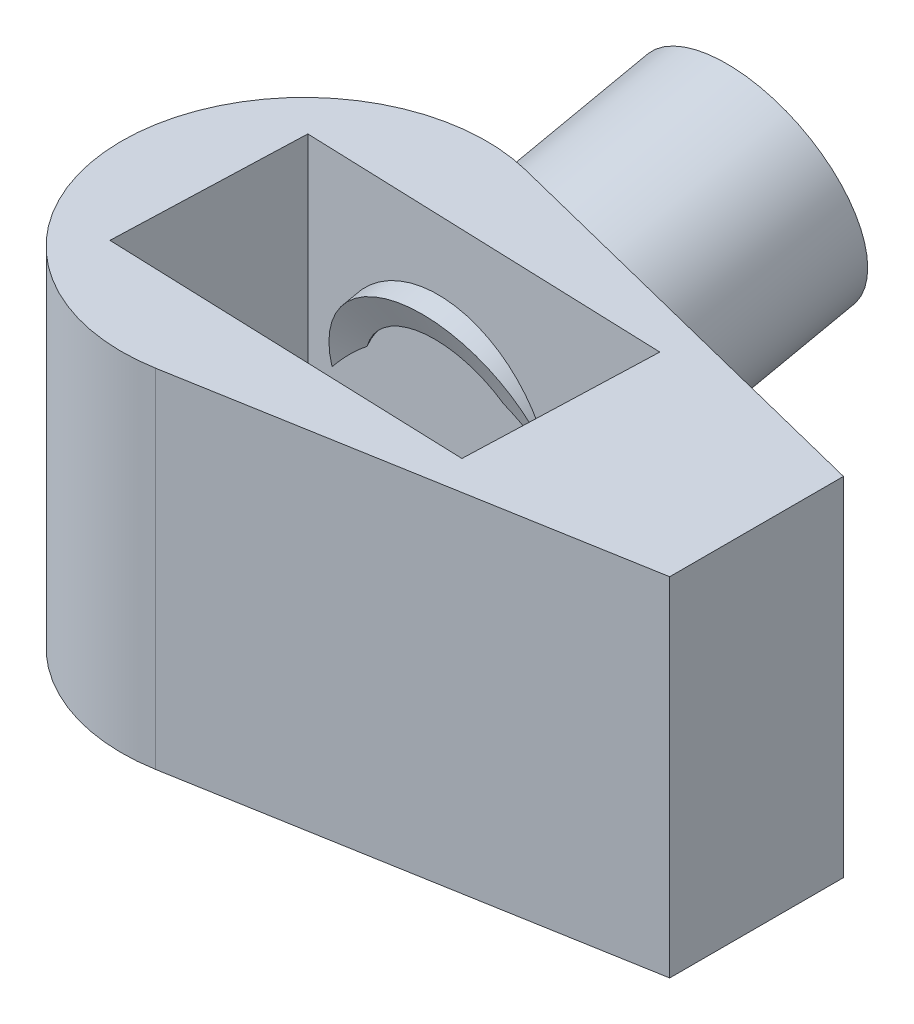
ISO-10303-21;
HEADER;
FILE_DESCRIPTION(('STEP AP214'),'2;1');
FILE_NAME('part.step','',(''),(''),'','','');
FILE_SCHEMA(('AUTOMOTIVE_DESIGN { 1 0 10303 214 1 1 1 1 }'));
ENDSEC;
DATA;
#1=APPLICATION_CONTEXT('core data for automotive mechanical design processes');
#2=APPLICATION_PROTOCOL_DEFINITION('international standard','automotive_design',2000,#1);
#3=PRODUCT_CONTEXT('',#1,'mechanical');
#4=PRODUCT('Part','Part','',(#3));
#5=PRODUCT_RELATED_PRODUCT_CATEGORY('part','',(#4));
#6=PRODUCT_DEFINITION_FORMATION('','',#4);
#7=PRODUCT_DEFINITION_CONTEXT('part definition',#1,'design');
#8=PRODUCT_DEFINITION('design','',#6,#7);
#9=PRODUCT_DEFINITION_SHAPE('','',#8);
#10=(LENGTH_UNIT() NAMED_UNIT(*) SI_UNIT(.MILLI.,.METRE.));
#11=(NAMED_UNIT(*) PLANE_ANGLE_UNIT() SI_UNIT($,.RADIAN.));
#12=(NAMED_UNIT(*) SI_UNIT($,.STERADIAN.) SOLID_ANGLE_UNIT());
#13=UNCERTAINTY_MEASURE_WITH_UNIT(LENGTH_MEASURE(1.E-05),#10,'distance_accuracy_value','');
#14=(GEOMETRIC_REPRESENTATION_CONTEXT(3) GLOBAL_UNCERTAINTY_ASSIGNED_CONTEXT((#13)) GLOBAL_UNIT_ASSIGNED_CONTEXT((#10,
#11,#12)) REPRESENTATION_CONTEXT('',''));
#15=CARTESIAN_POINT('',(0.,0.,0.));
#16=DIRECTION('',(0.,0.,1.));
#17=DIRECTION('',(1.,0.,0.));
#18=AXIS2_PLACEMENT_3D('',#15,#16,#17);
#19=CARTESIAN_POINT('',(0.390162289046507,15.,-11.0216444965026));
#20=DIRECTION('',(-0.0353774843420394,0.,0.999374020875882));
#21=DIRECTION('',(0.999374020875883,0.,0.0353774843420394));
#22=AXIS2_PLACEMENT_3D('',#19,#20,#21);
#23=PLANE('',#22);
#24=DIRECTION('',(0.999374020875883,0.,0.0353774843420394));
#25=VECTOR('',#24,1.);
#26=CARTESIAN_POINT('',(0.390162289046507,40.,-11.0216444965026));
#27=LINE('',#26,#25);
#28=CARTESIAN_POINT('',(-10.9888395087413,40.,-11.4244571067168));
#29=VERTEX_POINT('',#28);
#30=CARTESIAN_POINT('',(31.0111604912587,40.,-9.93767206795486));
#31=VERTEX_POINT('',#30);
#32=EDGE_CURVE('E273',#29,#31,#27,.T.);
#33=ORIENTED_EDGE('',*,*,#32,.F.);
#34=DIRECTION('',(0.,1.,0.));
#35=VECTOR('',#34,1.);
#36=CARTESIAN_POINT('',(-10.9888395087413,15.,-11.4244571067168));
#37=LINE('',#36,#35);
#38=CARTESIAN_POINT('',(-10.9888395087413,15.,-11.4244571067168));
#39=VERTEX_POINT('',#38);
#40=EDGE_CURVE('E312',#39,#29,#37,.T.);
#41=ORIENTED_EDGE('',*,*,#40,.F.);
#42=DIRECTION('',(0.999374020875883,0.,0.0353774843420394));
#43=VECTOR('',#42,1.);
#44=CARTESIAN_POINT('',(0.390162289046507,15.,-11.0216444965026));
#45=LINE('',#44,#43);
#46=CARTESIAN_POINT('',(31.0111604912587,15.,-9.93767206795486));
#47=VERTEX_POINT('',#46);
#48=EDGE_CURVE('E290',#39,#47,#45,.T.);
#49=ORIENTED_EDGE('',*,*,#48,.T.);
#50=DIRECTION('',(0.,1.,0.));
#51=VECTOR('',#50,1.);
#52=CARTESIAN_POINT('',(31.0111604912587,15.,-9.93767206795486));
#53=LINE('',#52,#51);
#54=EDGE_CURVE('E298',#47,#31,#53,.T.);
#55=ORIENTED_EDGE('',*,*,#54,.T.);
#56=EDGE_LOOP('',(#33,#41,#49,#55));
#57=FACE_BOUND('',#56,.T.);
#58=CARTESIAN_POINT('',(-8.10463004129563,18.2823321103349,-11.3223571189822));
#59=CARTESIAN_POINT('',(-7.86507218803505,18.5747643194951,-11.3138768563121));
#60=CARTESIAN_POINT('',(-7.62092300390691,18.8634162145207,-11.3052340621647));
#61=CARTESIAN_POINT('',(-7.12270332793711,19.4321999292052,-11.2875972631112));
#62=CARTESIAN_POINT('',(-6.86862911426903,19.7123284812365,-11.2786031264537));
#63=CARTESIAN_POINT('',(-6.08797754124081,20.5410367033428,-11.2509683388521));
#64=CARTESIAN_POINT('',(-5.54546133926437,21.0748591606041,-11.2317634585573));
#65=CARTESIAN_POINT('',(-4.40533458470522,22.098919349614,-11.1914033775818));
#66=CARTESIAN_POINT('',(-3.80700800324318,22.5883651434617,-11.1702228297339));
#67=CARTESIAN_POINT('',(-2.56073842819134,23.497381559857,-11.1261053307231));
#68=CARTESIAN_POINT('',(-1.91291852857135,23.9171177944699,-11.103172737043));
#69=CARTESIAN_POINT('',(-0.859637213780255,24.5062664109901,-11.0658869536992));
#70=CARTESIAN_POINT('',(-0.470643175732469,24.7053910257217,-11.0521167033197));
#71=CARTESIAN_POINT('',(0.322025251611424,25.0722064811563,-11.0240565233561));
#72=CARTESIAN_POINT('',(0.72570062138474,25.2398952178277,-11.0097665590633));
#73=CARTESIAN_POINT('',(1.54311872938382,25.5397335489275,-10.9808302492208));
#74=CARTESIAN_POINT('',(1.95678003143542,25.6721047555759,-10.9661867864826));
#75=CARTESIAN_POINT('',(2.79404508436814,25.9003924441802,-10.9365479018593));
#76=CARTESIAN_POINT('',(3.21764840909109,25.9963104856577,-10.92155249506));
#77=CARTESIAN_POINT('',(4.07346648592365,26.1506931040782,-10.8912568399996));
#78=CARTESIAN_POINT('',(4.50571000202654,26.2089981662866,-10.8759555735033));
#79=CARTESIAN_POINT('',(5.37362324879664,26.2873762894889,-10.8452317537357));
#80=CARTESIAN_POINT('',(5.80929300527063,26.3074490622358,-10.8298091995508));
#81=CARTESIAN_POINT('',(6.68178542557414,26.3104219272778,-10.7989232786712));
#82=CARTESIAN_POINT('',(7.11860830476361,26.2932310484653,-10.783459904353));
#83=CARTESIAN_POINT('',(7.98940117316629,26.2235597669514,-10.7526341470053));
#84=CARTESIAN_POINT('',(8.42337082274452,26.1710752371969,-10.7372717759989));
#85=CARTESIAN_POINT('',(9.42810760415459,26.0108756786185,-10.7017044518443));
#86=CARTESIAN_POINT('',(9.99689469437586,25.8906689712896,-10.6815695914637));
#87=CARTESIAN_POINT('',(11.1214685021807,25.5999200636733,-10.6417600792631));
#88=CARTESIAN_POINT('',(11.677249422524,25.4293558619823,-10.6220856326632));
#89=CARTESIAN_POINT('',(12.7748099584142,25.0447603734219,-10.5832323806656));
#90=CARTESIAN_POINT('',(13.3165557831709,24.8306335111947,-10.5640547714499));
#91=CARTESIAN_POINT('',(14.3838694000311,24.3658356829621,-10.5262722496115));
#92=CARTESIAN_POINT('',(14.9094409542287,24.115173294035,-10.5076672038119));
#93=CARTESIAN_POINT('',(15.9223723640675,23.5944711219716,-10.47180979273));
#94=CARTESIAN_POINT('',(16.4104036562152,23.3257273654761,-10.4545336588345));
#95=CARTESIAN_POINT('',(17.369325834972,22.7658825980183,-10.4205881552937));
#96=CARTESIAN_POINT('',(17.8403066467389,22.474936194069,-10.4039156023299));
#97=CARTESIAN_POINT('',(18.3046300412956,22.1740563894652,-10.3874787195639));
#98=B_SPLINE_CURVE_WITH_KNOTS('',3,(#58,#59,#60,#61,#62,#63,#64,#65,#66,#67,#68,#69,#70,#71,#72,
#73,#74,#75,#76,#77,#78,#79,#80,#81,#82,#83,#84,#85,#86,#87,#88,#89,#90,#91,#92,#93,#94,#95,#96,
#97),.UNSPECIFIED.,.F.,.F.,(4,2,2,2,2,2,2,2,2,2,2,2,2,2,2,2,2,2,2,4),(0.,1.13427500789395,
2.26897952397378,4.55024551512717,6.86641979101333,9.17701017769297,10.4874812567885,
11.7980400155992,13.1001707584187,14.4022457878421,15.7098071673346,17.0173784049656,
18.328145388068,19.6390656719955,21.3813941843134,23.1244850567162,24.8714422866016,
26.6179900594822,28.2894651268306,29.9502095321943),.UNSPECIFIED.);
#99=CARTESIAN_POINT('',(12.3552544705409,25.1913241914903,-10.5980844954823));
#100=VERTEX_POINT('',#99);
#101=CARTESIAN_POINT('',(17.6710159300358,22.5757516833046,-10.4099084333965));
#102=VERTEX_POINT('',#101);
#103=EDGE_CURVE('E130',#100,#102,#98,.T.);
#104=ORIENTED_EDGE('',*,*,#103,.F.);
#105=CARTESIAN_POINT('',(5.1,18.5393786705713,-10.854917919273));
#106=DIRECTION('',(-0.0353774843420394,0.,0.999374020875882));
#107=DIRECTION('',(0.163919590360563,-0.9864566369717,0.00580269510733514));
#108=AXIS2_PLACEMENT_3D('',#105,#106,#107);
#109=ELLIPSE('',#108,10.0062637121946,9.78105928984873);
#110=CARTESIAN_POINT('',(-3.9161072784306,22.4841222657709,-11.1740849052122));
#111=VERTEX_POINT('',#110);
#112=EDGE_CURVE('E11',#100,#111,#109,.T.);
#113=ORIENTED_EDGE('',*,*,#112,.T.);
#114=CARTESIAN_POINT('',(-8.09997176306033,18.2880178975854,-11.3221922175921));
#115=VERTEX_POINT('',#114);
#116=EDGE_CURVE('E43',#115,#111,#98,.T.);
#117=ORIENTED_EDGE('',*,*,#116,.F.);
#118=CARTESIAN_POINT('',(5.1,18.5393786705713,-10.854917919273));
#119=DIRECTION('',(-0.0353774843420394,0.,0.999374020875882));
#120=DIRECTION('',(0.163919590360563,-0.9864566369717,0.00580269510733514));
#121=AXIS2_PLACEMENT_3D('',#118,#119,#120);
#122=ELLIPSE('',#121,13.5084560114626,13.2044300412956);
#123=EDGE_CURVE('E123',#102,#115,#122,.T.);
#124=ORIENTED_EDGE('',*,*,#123,.F.);
#125=EDGE_LOOP('',(#104,#113,#117,#124));
#126=FACE_BOUND('',#125,.T.);
#127=ADVANCED_FACE('F34',(#57,#126),#23,.T.);
#128=CARTESIAN_POINT('',(0.,40.,0.));
#129=DIRECTION('',(0.,-1.,0.));
#130=DIRECTION('',(0.,0.,-1.));
#131=AXIS2_PLACEMENT_3D('',#128,#129,#130);
#132=CYLINDRICAL_SURFACE('',#131,6.);
#133=CARTESIAN_POINT('',(0.,6.,0.));
#134=DIRECTION('',(0.,-1.,0.));
#135=DIRECTION('',(0.,0.,-1.));
#136=AXIS2_PLACEMENT_3D('',#133,#134,#135);
#137=CIRCLE('',#136,6.);
#138=CARTESIAN_POINT('',(0.,6.,-6.));
#139=VERTEX_POINT('',#138);
#140=EDGE_CURVE('E309',#139,#139,#137,.T.);
#141=ORIENTED_EDGE('',*,*,#140,.T.);
#142=EDGE_LOOP('',(#141));
#143=FACE_BOUND('',#142,.T.);
#144=CARTESIAN_POINT('',(0.,9.5,0.));
#145=DIRECTION('',(0.,1.,0.));
#146=DIRECTION('',(0.,0.,1.));
#147=AXIS2_PLACEMENT_3D('',#144,#145,#146);
#148=CIRCLE('',#147,6.);
#149=CARTESIAN_POINT('',(0.,9.5,6.));
#150=VERTEX_POINT('',#149);
#151=EDGE_CURVE('E266',#150,#150,#148,.F.);
#152=ORIENTED_EDGE('',*,*,#151,.F.);
#153=EDGE_LOOP('',(#152));
#154=FACE_BOUND('',#153,.T.);
#155=ADVANCED_FACE('F179',(#143,#154),#132,.F.);
#156=CARTESIAN_POINT('',(0.,40.,0.));
#157=DIRECTION('',(0.,1.,0.));
#158=DIRECTION('',(0.,0.,1.));
#159=AXIS2_PLACEMENT_3D('',#156,#157,#158);
#160=PLANE('',#159);
#161=CARTESIAN_POINT('',(0.,40.,0.));
#162=DIRECTION('',(0.,1.,0.));
#163=DIRECTION('',(0.,0.,1.));
#164=AXIS2_PLACEMENT_3D('',#161,#162,#163);
#165=CIRCLE('',#164,21.);
#166=CARTESIAN_POINT('',(5.10954501363541,40.,-20.3689113541601));
#167=VERTEX_POINT('',#166);
#168=CARTESIAN_POINT('',(3.61379341166937,40.,20.6867227268549));
#169=VERTEX_POINT('',#168);
#170=EDGE_CURVE('E135',#167,#169,#165,.T.);
#171=ORIENTED_EDGE('',*,*,#170,.T.);
#172=DIRECTION('',(0.985082034612138,0.,-0.172085400555684));
#173=VECTOR('',#172,1.);
#174=CARTESIAN_POINT('',(53.9751275761126,40.,11.889028669203));
#175=LINE('',#174,#173);
#176=CARTESIAN_POINT('',(53.9751275761126,40.,11.889028669203));
#177=VERTEX_POINT('',#176);
#178=EDGE_CURVE('E320',#169,#177,#175,.T.);
#179=ORIENTED_EDGE('',*,*,#178,.T.);
#180=DIRECTION('',(0.,0.,-1.));
#181=VECTOR('',#180,1.);
#182=CARTESIAN_POINT('',(53.9751275761126,40.,-8.11097133079702));
#183=LINE('',#182,#181);
#184=CARTESIAN_POINT('',(53.9751275761126,40.,-8.11097133079702));
#185=VERTEX_POINT('',#184);
#186=EDGE_CURVE('E252',#177,#185,#183,.T.);
#187=ORIENTED_EDGE('',*,*,#186,.T.);
#188=DIRECTION('',(-0.969948159721911,0.,-0.243311667315972));
#189=VECTOR('',#188,1.);
#190=CARTESIAN_POINT('',(53.9751275761126,40.,-8.11097133079702));
#191=LINE('',#190,#189);
#192=EDGE_CURVE('E256',#185,#167,#191,.T.);
#193=ORIENTED_EDGE('',*,*,#192,.T.);
#194=EDGE_LOOP('',(#171,#179,#187,#193));
#195=FACE_BOUND('',#194,.T.);
#196=ORIENTED_EDGE('',*,*,#32,.T.);
#197=DIRECTION('',(-0.0353774843420385,0.,0.999374020875883));
#198=VECTOR('',#197,1.);
#199=CARTESIAN_POINT('',(30.6209982022122,40.,1.08397242854774));
#200=LINE('',#199,#198);
#201=CARTESIAN_POINT('',(30.2323683280976,40.,12.0623279320451));
#202=VERTEX_POINT('',#201);
#203=EDGE_CURVE('E268',#31,#202,#200,.T.);
#204=ORIENTED_EDGE('',*,*,#203,.T.);
#205=DIRECTION('',(0.999374020875883,0.,0.0353774843420387));
#206=VECTOR('',#205,1.);
#207=CARTESIAN_POINT('',(-0.388629874114518,40.,10.9783555034974));
#208=LINE('',#207,#206);
#209=CARTESIAN_POINT('',(-11.7676316719024,40.,10.5755428932832));
#210=VERTEX_POINT('',#209);
#211=EDGE_CURVE('E291',#210,#202,#208,.T.);
#212=ORIENTED_EDGE('',*,*,#211,.F.);
#213=DIRECTION('',(-0.035377484342039,0.,0.999374020875883));
#214=VECTOR('',#213,1.);
#215=CARTESIAN_POINT('',(-11.3790017977878,40.,-0.402812610214199));
#216=LINE('',#215,#214);
#217=EDGE_CURVE('E302',#29,#210,#216,.T.);
#218=ORIENTED_EDGE('',*,*,#217,.F.);
#219=EDGE_LOOP('',(#196,#204,#212,#218));
#220=FACE_BOUND('',#219,.T.);
#221=ADVANCED_FACE('F191',(#195,#220),#160,.T.);
#222=CARTESIAN_POINT('',(0.,40.,0.));
#223=DIRECTION('',(0.,-1.,0.));
#224=DIRECTION('',(0.,0.,-1.));
#225=AXIS2_PLACEMENT_3D('',#222,#223,#224);
#226=CYLINDRICAL_SURFACE('',#225,21.);
#227=DIRECTION('',(0.,-1.,0.));
#228=VECTOR('',#227,1.);
#229=CARTESIAN_POINT('',(5.10954501363541,40.,-20.3689113541601));
#230=LINE('',#229,#228);
#231=CARTESIAN_POINT('',(5.10954501363541,34.0636290657894,-20.3689113541601));
#232=VERTEX_POINT('',#231);
#233=EDGE_CURVE('E237',#167,#232,#230,.T.);
#234=ORIENTED_EDGE('',*,*,#233,.T.);
#235=CARTESIAN_POINT('',(5.10954501363542,34.0636290657894,-20.3689113541601));
#236=CARTESIAN_POINT('',(4.96690858849741,34.071348619486,-20.4046932743508));
#237=CARTESIAN_POINT('',(4.82377420576992,34.076390010948,-20.4390039409712));
#238=CARTESIAN_POINT('',(4.53672862365238,34.0810190605895,-20.5046278810853));
#239=CARTESIAN_POINT('',(4.39281740268119,34.0806065664686,-20.5359410708494));
#240=CARTESIAN_POINT('',(3.96032095910489,34.0710430746702,-20.6252864457771));
#241=CARTESIAN_POINT('',(3.67091161737172,34.0535694600003,-20.6787398236085));
#242=CARTESIAN_POINT('',(3.09365112153879,33.9961488780052,-20.7729271192266));
#243=CARTESIAN_POINT('',(2.8057988668544,33.9563044771656,-20.8137177774438));
#244=CARTESIAN_POINT('',(2.232605276756,33.8542486196363,-20.8829785388524));
#245=CARTESIAN_POINT('',(1.94726373138935,33.7920390517508,-20.9114496820158));
#246=CARTESIAN_POINT('',(1.38109937488225,33.6456343705411,-20.9564616476082));
#247=CARTESIAN_POINT('',(1.10028018529665,33.561422484691,-20.972993332155));
#248=CARTESIAN_POINT('',(0.545422540072888,33.3718304653229,-20.9947521701638));
#249=CARTESIAN_POINT('',(0.271384690003213,33.266448448935,-20.9999783176253));
#250=CARTESIAN_POINT('',(-0.268194514379263,33.0355528892135,-21.000021561548));
#251=CARTESIAN_POINT('',(-0.533732042190592,32.910030428177,-20.994834035319));
#252=CARTESIAN_POINT('',(-1.05467272261733,32.6401556915788,-20.9751191491249));
#253=CARTESIAN_POINT('',(-1.31007576924992,32.4958032191672,-20.9605916915135));
#254=CARTESIAN_POINT('',(-1.81498400809248,32.1862867400207,-20.9229854193896));
#255=CARTESIAN_POINT('',(-2.06423924069272,32.0207376365431,-20.8997270853096));
#256=CARTESIAN_POINT('',(-2.54998013297256,31.6728077159789,-20.8460389225978));
#257=CARTESIAN_POINT('',(-2.78646185507135,31.4904217551472,-20.8156068979265));
#258=CARTESIAN_POINT('',(-3.24589404486634,31.1102193410556,-20.7489294558432));
#259=CARTESIAN_POINT('',(-3.46884076599773,30.9123986496908,-20.7126824388309));
#260=CARTESIAN_POINT('',(-3.9005792875719,30.5026952048927,-20.6357352827187));
#261=CARTESIAN_POINT('',(-4.10937037826527,30.2908117474188,-20.5950349205996));
#262=CARTESIAN_POINT('',(-4.54807572032634,29.815518686567,-20.5030180512679));
#263=CARTESIAN_POINT('',(-4.77518160312074,29.549629701146,-20.4510980158676));
#264=CARTESIAN_POINT('',(-5.20864006606995,29.0018513412773,-20.3450207319004));
#265=CARTESIAN_POINT('',(-5.41499010791089,28.7199600164187,-20.2908632108422));
#266=CARTESIAN_POINT('',(-5.80656924791153,28.1416064504079,-20.1822958669106));
#267=CARTESIAN_POINT('',(-5.99178237295665,27.8451334288486,-20.127885885144));
#268=CARTESIAN_POINT('',(-6.34039384285721,27.2393210942914,-20.0208056225972));
#269=CARTESIAN_POINT('',(-6.50379093681024,26.9299810448479,-19.9681354417049));
#270=CARTESIAN_POINT('',(-6.83141087320832,26.2517951250423,-19.858652011427));
#271=CARTESIAN_POINT('',(-6.99195841855568,25.8810695740226,-19.8024321517711));
#272=CARTESIAN_POINT('',(-7.28224671649502,25.1266637508893,-19.6975307313211));
#273=CARTESIAN_POINT('',(-7.41198431886526,24.7429821586377,-19.6488499415505));
#274=CARTESIAN_POINT('',(-7.63939205987374,23.9651725107016,-19.5615577214256));
#275=CARTESIAN_POINT('',(-7.73706934758696,23.5710468051454,-19.5229440466181));
#276=CARTESIAN_POINT('',(-7.89905704770002,22.7749951747849,-19.4579686075227));
#277=CARTESIAN_POINT('',(-7.96336993127771,22.3730698299592,-19.4316059358634));
#278=CARTESIAN_POINT('',(-8.05631848899731,21.5731075465164,-19.3932518688941));
#279=CARTESIAN_POINT('',(-8.08568516819968,21.1751702382879,-19.3809662218588));
#280=CARTESIAN_POINT('',(-8.11013083862967,20.3780291763897,-19.3707504355202));
#281=CARTESIAN_POINT('',(-8.10521011547181,19.9788254332971,-19.3728201766365));
#282=CARTESIAN_POINT('',(-8.06034754464219,19.1830056966958,-19.3915287220619));
#283=CARTESIAN_POINT('',(-8.02043081967606,18.7863880524199,-19.4081570751162));
#284=CARTESIAN_POINT('',(-7.90531446838263,17.9991608678849,-19.4553301217445));
#285=CARTESIAN_POINT('',(-7.83011807563186,17.6085507803878,-19.4858735399183));
#286=CARTESIAN_POINT('',(-7.65459269815676,16.8781762575065,-19.55543613092));
#287=CARTESIAN_POINT('',(-7.55780359923154,16.5374353308134,-19.5932024296849));
#288=CARTESIAN_POINT('',(-7.33678456353165,15.8660492015516,-19.6770311253634));
#289=CARTESIAN_POINT('',(-7.21255676740382,15.5354032137092,-19.7230928750506));
#290=CARTESIAN_POINT('',(-6.9374049003406,14.8862837969699,-19.8215475303034));
#291=CARTESIAN_POINT('',(-6.78647262725708,14.5678141446266,-19.8739423794781));
#292=CARTESIAN_POINT('',(-6.45895209504381,13.9450759701463,-19.9827850819058));
#293=CARTESIAN_POINT('',(-6.28236299028932,13.6408079165175,-20.0392330687153));
#294=CARTESIAN_POINT('',(-5.90438842736474,13.0476387717968,-20.1538395924901));
#295=CARTESIAN_POINT('',(-5.70295862705616,12.7587665184868,-20.2120010430699));
#296=CARTESIAN_POINT('',(-5.27690755897406,12.1984767424352,-20.3273938529849));
#297=CARTESIAN_POINT('',(-5.05228647532779,11.9270590811405,-20.3846252197003));
#298=CARTESIAN_POINT('',(-4.58135756531356,11.4030314695946,-20.4956010841604));
#299=CARTESIAN_POINT('',(-4.33505228026011,11.1504193217886,-20.5493459892276));
#300=CARTESIAN_POINT('',(-3.8223456118923,10.6651647181945,-20.650858617518));
#301=CARTESIAN_POINT('',(-3.55594371289541,10.432522775173,-20.6986261872781));
#302=CARTESIAN_POINT('',(-2.99363811399702,9.97930617286293,-20.787553484592));
#303=CARTESIAN_POINT('',(-2.69697633890694,9.75960268083953,-20.8283669552564));
#304=CARTESIAN_POINT('',(-2.08601505129109,9.34415028397307,-20.8983989554022));
#305=CARTESIAN_POINT('',(-1.77171511411762,9.14840195622395,-20.9276172055859));
#306=CARTESIAN_POINT('',(-1.12792467548618,8.78187507210793,-20.9721690598717));
#307=CARTESIAN_POINT('',(-0.798434333282665,8.61109625404182,-20.9875028095024));
#308=CARTESIAN_POINT('',(-0.126970551280799,8.29536413186931,-21.002301021992));
#309=CARTESIAN_POINT('',(0.215002446188015,8.15040991372281,-21.0017660466234));
#310=CARTESIAN_POINT('',(0.928362049040771,7.87942922051568,-20.982672773211));
#311=CARTESIAN_POINT('',(1.300313364921,7.75495551966405,-20.9630873965633));
#312=CARTESIAN_POINT('',(2.05131117046238,7.53599809262888,-20.9029682213082));
#313=CARTESIAN_POINT('',(2.43035851060243,7.44151798594972,-20.8624318959759));
#314=CARTESIAN_POINT('',(3.19332365361217,7.28230138473823,-20.7593676854117));
#315=CARTESIAN_POINT('',(3.5772546561457,7.21768185373307,-20.6967549864686));
#316=CARTESIAN_POINT('',(4.15273326354356,7.14321306807699,-20.5862347456592));
#317=CARTESIAN_POINT('',(4.34451759548051,7.12213213057295,-20.5466208515759));
#318=CARTESIAN_POINT('',(4.72753868983291,7.08736395951102,-20.4618879576455));
#319=CARTESIAN_POINT('',(4.91877545619085,7.07367667258499,-20.4167689975373));
#320=CARTESIAN_POINT('',(5.10954501363542,7.06363611998609,-20.3689113541601));
#321=B_SPLINE_CURVE_WITH_KNOTS('',3,(#235,#236,#237,#238,#239,#240,#241,#242,#243,#244,#245,
#246,#247,#248,#249,#250,#251,#252,#253,#254,#255,#256,#257,#258,#259,#260,#261,#262,#263,#264,
#265,#266,#267,#268,#269,#270,#271,#272,#273,#274,#275,#276,#277,#278,#279,#280,#281,#282,#283,
#284,#285,#286,#287,#288,#289,#290,#291,#292,#293,#294,#295,#296,#297,#298,#299,#300,#301,#302,
#303,#304,#305,#306,#307,#308,#309,#310,#311,#312,#313,#314,#315,#316,#317,#318,#319,#320),
.UNSPECIFIED.,.F.,.F.,(4,2,2,2,2,2,2,2,2,2,2,2,2,2,2,2,2,2,2,2,2,2,2,2,2,2,2,2,2,2,2,2,2,2,2,2,
2,2,2,2,2,2,4),(0.,0.441710081270945,0.883432497377931,1.7666879719092,2.64592654695832,
3.52509088516254,4.40492738207036,5.28484216623813,6.16514763605673,7.04546230937295,
7.94496828906273,8.84474998759902,9.74477962573171,10.6448543571448,11.7043437539809,
12.7639625628336,13.8243768934597,14.8848520007548,16.1070759594581,17.3294248330425,
18.5515009516638,19.773486542706,20.9694342459812,22.165371987008,23.3604518982399,
24.5554222951859,25.6228273852867,26.6901492305182,27.7577994692779,28.8254849047583,
29.8951045861994,30.9647157760456,32.0342017775559,33.1037152315997,34.2165734298752,
35.3294584322809,36.4423317699799,37.5551657106298,38.7315233328004,39.9080228590874,
41.0890924523618,41.679798581461,42.2705004467247),.UNSPECIFIED.);
#322=CARTESIAN_POINT('',(5.10954501363541,7.06363611998609,-20.3689113541601));
#323=VERTEX_POINT('',#322);
#324=EDGE_CURVE('E56',#232,#323,#321,.T.);
#325=ORIENTED_EDGE('',*,*,#324,.T.);
#326=CARTESIAN_POINT('',(5.10954501363541,0.,-20.3689113541601));
#327=VERTEX_POINT('',#326);
#328=EDGE_CURVE('E241',#323,#327,#230,.T.);
#329=ORIENTED_EDGE('',*,*,#328,.T.);
#330=CARTESIAN_POINT('',(0.,0.,0.));
#331=DIRECTION('',(0.,1.,0.));
#332=DIRECTION('',(0.,0.,1.));
#333=AXIS2_PLACEMENT_3D('',#330,#331,#332);
#334=CIRCLE('',#333,21.);
#335=CARTESIAN_POINT('',(3.61379341166937,0.,20.6867227268549));
#336=VERTEX_POINT('',#335);
#337=EDGE_CURVE('E230',#327,#336,#334,.T.);
#338=ORIENTED_EDGE('',*,*,#337,.T.);
#339=DIRECTION('',(0.,-1.,0.));
#340=VECTOR('',#339,1.);
#341=CARTESIAN_POINT('',(3.61379341166937,40.,20.6867227268549));
#342=LINE('',#341,#340);
#343=EDGE_CURVE('E261',#169,#336,#342,.T.);
#344=ORIENTED_EDGE('',*,*,#343,.F.);
#345=ORIENTED_EDGE('',*,*,#170,.F.);
#346=EDGE_LOOP('',(#234,#325,#329,#338,#344,#345));
#347=FACE_BOUND('',#346,.T.);
#348=ADVANCED_FACE('F36',(#347),#226,.T.);
#349=CARTESIAN_POINT('',(0.,0.,0.));
#350=DIRECTION('',(0.,1.,0.));
#351=DIRECTION('',(0.,0.,1.));
#352=AXIS2_PLACEMENT_3D('',#349,#350,#351);
#353=PLANE('',#352);
#354=CARTESIAN_POINT('',(0.,0.,0.));
#355=DIRECTION('',(0.,-1.,0.));
#356=DIRECTION('',(0.,0.,-1.));
#357=AXIS2_PLACEMENT_3D('',#354,#355,#356);
#358=CIRCLE('',#357,8.22726922087799);
#359=CARTESIAN_POINT('',(0.,0.,-8.22726922087799));
#360=VERTEX_POINT('',#359);
#361=EDGE_CURVE('E226',#360,#360,#358,.T.);
#362=ORIENTED_EDGE('',*,*,#361,.F.);
#363=EDGE_LOOP('',(#362));
#364=FACE_BOUND('',#363,.T.);
#365=ORIENTED_EDGE('',*,*,#337,.F.);
#366=DIRECTION('',(-0.969948159721911,0.,-0.243311667315972));
#367=VECTOR('',#366,1.);
#368=CARTESIAN_POINT('',(53.9751275761126,0.,-8.11097133079702));
#369=LINE('',#368,#367);
#370=CARTESIAN_POINT('',(53.9751275761126,0.,-8.11097133079702));
#371=VERTEX_POINT('',#370);
#372=EDGE_CURVE('E233',#371,#327,#369,.T.);
#373=ORIENTED_EDGE('',*,*,#372,.F.);
#374=DIRECTION('',(0.,0.,-1.));
#375=VECTOR('',#374,1.);
#376=CARTESIAN_POINT('',(53.9751275761126,0.,-8.11097133079702));
#377=LINE('',#376,#375);
#378=CARTESIAN_POINT('',(53.9751275761126,0.,11.889028669203));
#379=VERTEX_POINT('',#378);
#380=EDGE_CURVE('E247',#379,#371,#377,.T.);
#381=ORIENTED_EDGE('',*,*,#380,.F.);
#382=DIRECTION('',(0.985082034612138,0.,-0.172085400555684));
#383=VECTOR('',#382,1.);
#384=CARTESIAN_POINT('',(53.9751275761126,0.,11.889028669203));
#385=LINE('',#384,#383);
#386=EDGE_CURVE('E234',#336,#379,#385,.T.);
#387=ORIENTED_EDGE('',*,*,#386,.F.);
#388=EDGE_LOOP('',(#365,#373,#381,#387));
#389=FACE_BOUND('',#388,.T.);
#390=ADVANCED_FACE('F211',(#364,#389),#353,.F.);
#391=CARTESIAN_POINT('',(53.9751275761126,40.,-8.11097133079702));
#392=DIRECTION('',(-0.243311667315972,0.,0.969948159721911));
#393=DIRECTION('',(0.969948159721911,0.,0.243311667315972));
#394=AXIS2_PLACEMENT_3D('',#391,#392,#393);
#395=PLANE('',#394);
#396=ORIENTED_EDGE('',*,*,#328,.F.);
#397=CARTESIAN_POINT('',(5.1,20.5641420329638,-20.3713057225178));
#398=DIRECTION('',(-0.243311667315972,0.,0.969948159721911));
#399=DIRECTION('',(0.730156283383229,-0.658273710171416,0.183159832750383));
#400=AXIS2_PLACEMENT_3D('',#397,#398,#399);
#401=ELLIPSE('',#400,13.9182696154307,13.2044300412956);
#402=EDGE_CURVE('E141',#323,#232,#401,.T.);
#403=ORIENTED_EDGE('',*,*,#402,.T.);
#404=ORIENTED_EDGE('',*,*,#233,.F.);
#405=ORIENTED_EDGE('',*,*,#192,.F.);
#406=DIRECTION('',(0.,-1.,0.));
#407=VECTOR('',#406,1.);
#408=CARTESIAN_POINT('',(53.9751275761126,40.,-8.11097133079702));
#409=LINE('',#408,#407);
#410=EDGE_CURVE('E244',#185,#371,#409,.T.);
#411=ORIENTED_EDGE('',*,*,#410,.T.);
#412=ORIENTED_EDGE('',*,*,#372,.T.);
#413=EDGE_LOOP('',(#396,#403,#404,#405,#411,#412));
#414=FACE_BOUND('',#413,.T.);
#415=ADVANCED_FACE('F207',(#414),#395,.F.);
#416=CARTESIAN_POINT('',(53.9751275761126,40.,11.889028669203));
#417=DIRECTION('',(-0.172085400555684,0.,-0.985082034612138));
#418=DIRECTION('',(-0.985082034612138,0.,0.172085400555684));
#419=AXIS2_PLACEMENT_3D('',#416,#417,#418);
#420=PLANE('',#419);
#421=ORIENTED_EDGE('',*,*,#386,.T.);
#422=DIRECTION('',(0.,-1.,0.));
#423=VECTOR('',#422,1.);
#424=CARTESIAN_POINT('',(53.9751275761126,40.,11.889028669203));
#425=LINE('',#424,#423);
#426=EDGE_CURVE('E258',#177,#379,#425,.T.);
#427=ORIENTED_EDGE('',*,*,#426,.F.);
#428=ORIENTED_EDGE('',*,*,#178,.F.);
#429=ORIENTED_EDGE('',*,*,#343,.T.);
#430=EDGE_LOOP('',(#421,#427,#428,#429));
#431=FACE_BOUND('',#430,.T.);
#432=ADVANCED_FACE('F203',(#431),#420,.F.);
#433=CARTESIAN_POINT('',(53.9751275761126,40.,-8.11097133079702));
#434=DIRECTION('',(-1.,0.,0.));
#435=DIRECTION('',(0.,0.,1.));
#436=AXIS2_PLACEMENT_3D('',#433,#434,#435);
#437=PLANE('',#436);
#438=ORIENTED_EDGE('',*,*,#380,.T.);
#439=ORIENTED_EDGE('',*,*,#410,.F.);
#440=ORIENTED_EDGE('',*,*,#186,.F.);
#441=ORIENTED_EDGE('',*,*,#426,.T.);
#442=EDGE_LOOP('',(#438,#439,#440,#441));
#443=FACE_BOUND('',#442,.T.);
#444=ADVANCED_FACE('F199',(#443),#437,.F.);
#445=CARTESIAN_POINT('',(0.,6.,0.));
#446=DIRECTION('',(0.,-1.,0.));
#447=DIRECTION('',(0.,0.,-1.));
#448=AXIS2_PLACEMENT_3D('',#445,#446,#447);
#449=CYLINDRICAL_SURFACE('',#448,8.22726922087799);
#450=CARTESIAN_POINT('',(0.,6.,0.));
#451=DIRECTION('',(0.,-1.,0.));
#452=DIRECTION('',(0.,0.,-1.));
#453=AXIS2_PLACEMENT_3D('',#450,#451,#452);
#454=CIRCLE('',#453,8.22726922087799);
#455=CARTESIAN_POINT('',(0.,6.,-8.22726922087799));
#456=VERTEX_POINT('',#455);
#457=EDGE_CURVE('E245',#456,#456,#454,.T.);
#458=ORIENTED_EDGE('',*,*,#457,.F.);
#459=EDGE_LOOP('',(#458));
#460=FACE_BOUND('',#459,.T.);
#461=ORIENTED_EDGE('',*,*,#361,.T.);
#462=EDGE_LOOP('',(#461));
#463=FACE_BOUND('',#462,.T.);
#464=ADVANCED_FACE('F195',(#460,#463),#449,.F.);
#465=CARTESIAN_POINT('',(0.,6.,0.));
#466=DIRECTION('',(0.,-1.,0.));
#467=DIRECTION('',(0.,0.,-1.));
#468=AXIS2_PLACEMENT_3D('',#465,#466,#467);
#469=PLANE('',#468);
#470=ORIENTED_EDGE('',*,*,#140,.F.);
#471=EDGE_LOOP('',(#470));
#472=FACE_BOUND('',#471,.T.);
#473=ORIENTED_EDGE('',*,*,#457,.T.);
#474=EDGE_LOOP('',(#473));
#475=FACE_BOUND('',#474,.T.);
#476=ADVANCED_FACE('F187',(#472,#475),#469,.T.);
#477=CARTESIAN_POINT('',(30.6209982022122,15.,1.08397242854774));
#478=DIRECTION('',(-0.999374020875883,0.,-0.0353774843420385));
#479=DIRECTION('',(-0.0353774843420385,0.,0.999374020875883));
#480=AXIS2_PLACEMENT_3D('',#477,#478,#479);
#481=PLANE('',#480);
#482=ORIENTED_EDGE('',*,*,#203,.F.);
#483=ORIENTED_EDGE('',*,*,#54,.F.);
#484=DIRECTION('',(-0.0353774843420385,0.,0.999374020875883));
#485=VECTOR('',#484,1.);
#486=CARTESIAN_POINT('',(30.6209982022122,15.,1.08397242854774));
#487=LINE('',#486,#485);
#488=CARTESIAN_POINT('',(30.2323683280976,15.,12.0623279320451));
#489=VERTEX_POINT('',#488);
#490=EDGE_CURVE('E288',#47,#489,#487,.T.);
#491=ORIENTED_EDGE('',*,*,#490,.T.);
#492=DIRECTION('',(0.,1.,0.));
#493=VECTOR('',#492,1.);
#494=CARTESIAN_POINT('',(30.2323683280976,15.,12.0623279320451));
#495=LINE('',#494,#493);
#496=EDGE_CURVE('E307',#489,#202,#495,.T.);
#497=ORIENTED_EDGE('',*,*,#496,.T.);
#498=EDGE_LOOP('',(#482,#483,#491,#497));
#499=FACE_BOUND('',#498,.T.);
#500=ADVANCED_FACE('F183',(#499),#481,.T.);
#501=CARTESIAN_POINT('',(-0.388629874114518,15.,10.9783555034974));
#502=DIRECTION('',(-0.0353774843420387,0.,0.999374020875883));
#503=DIRECTION('',(0.999374020875883,0.,0.0353774843420387));
#504=AXIS2_PLACEMENT_3D('',#501,#502,#503);
#505=PLANE('',#504);
#506=ORIENTED_EDGE('',*,*,#211,.T.);
#507=ORIENTED_EDGE('',*,*,#496,.F.);
#508=DIRECTION('',(0.999374020875883,0.,0.0353774843420387));
#509=VECTOR('',#508,1.);
#510=CARTESIAN_POINT('',(-0.388629874114518,15.,10.9783555034974));
#511=LINE('',#510,#509);
#512=CARTESIAN_POINT('',(-11.7676316719024,15.,10.5755428932832));
#513=VERTEX_POINT('',#512);
#514=EDGE_CURVE('E296',#513,#489,#511,.T.);
#515=ORIENTED_EDGE('',*,*,#514,.F.);
#516=DIRECTION('',(0.,1.,0.));
#517=VECTOR('',#516,1.);
#518=CARTESIAN_POINT('',(-11.7676316719024,15.,10.5755428932832));
#519=LINE('',#518,#517);
#520=EDGE_CURVE('E310',#513,#210,#519,.T.);
#521=ORIENTED_EDGE('',*,*,#520,.T.);
#522=EDGE_LOOP('',(#506,#507,#515,#521));
#523=FACE_BOUND('',#522,.T.);
#524=ADVANCED_FACE('F186',(#523),#505,.F.);
#525=CARTESIAN_POINT('',(-11.3790017977878,15.,-0.402812610214199));
#526=DIRECTION('',(-0.999374020875882,0.,-0.035377484342039));
#527=DIRECTION('',(-0.035377484342039,0.,0.999374020875883));
#528=AXIS2_PLACEMENT_3D('',#525,#526,#527);
#529=PLANE('',#528);
#530=ORIENTED_EDGE('',*,*,#217,.T.);
#531=ORIENTED_EDGE('',*,*,#520,.F.);
#532=DIRECTION('',(-0.035377484342039,0.,0.999374020875883));
#533=VECTOR('',#532,1.);
#534=CARTESIAN_POINT('',(-11.3790017977878,15.,-0.402812610214199));
#535=LINE('',#534,#533);
#536=EDGE_CURVE('E293',#39,#513,#535,.T.);
#537=ORIENTED_EDGE('',*,*,#536,.F.);
#538=ORIENTED_EDGE('',*,*,#40,.T.);
#539=EDGE_LOOP('',(#530,#531,#537,#538));
#540=FACE_BOUND('',#539,.T.);
#541=ADVANCED_FACE('F181',(#540),#529,.F.);
#542=CARTESIAN_POINT('',(0.,15.,0.));
#543=DIRECTION('',(0.,1.,0.));
#544=DIRECTION('',(0.,0.,1.));
#545=AXIS2_PLACEMENT_3D('',#542,#543,#544);
#546=PLANE('',#545);
#547=CARTESIAN_POINT('',(0.,15.,0.));
#548=DIRECTION('',(0.,1.,0.));
#549=DIRECTION('',(0.,0.,1.));
#550=AXIS2_PLACEMENT_3D('',#547,#548,#549);
#551=CIRCLE('',#550,9.55);
#552=CARTESIAN_POINT('',(0.,15.,9.55));
#553=VERTEX_POINT('',#552);
#554=EDGE_CURVE('E276',#553,#553,#551,.T.);
#555=ORIENTED_EDGE('',*,*,#554,.F.);
#556=EDGE_LOOP('',(#555));
#557=FACE_BOUND('',#556,.T.);
#558=ORIENTED_EDGE('',*,*,#490,.F.);
#559=ORIENTED_EDGE('',*,*,#48,.F.);
#560=ORIENTED_EDGE('',*,*,#536,.T.);
#561=ORIENTED_EDGE('',*,*,#514,.T.);
#562=EDGE_LOOP('',(#558,#559,#560,#561));
#563=FACE_BOUND('',#562,.T.);
#564=ADVANCED_FACE('F448',(#557,#563),#546,.T.);
#565=CARTESIAN_POINT('',(0.,9.5,0.));
#566=DIRECTION('',(0.,1.,0.));
#567=DIRECTION('',(0.,0.,1.));
#568=AXIS2_PLACEMENT_3D('',#565,#566,#567);
#569=PLANE('',#568);
#570=CARTESIAN_POINT('',(0.,9.5,0.));
#571=DIRECTION('',(0.,1.,0.));
#572=DIRECTION('',(0.,0.,1.));
#573=AXIS2_PLACEMENT_3D('',#570,#571,#572);
#574=CIRCLE('',#573,9.55);
#575=CARTESIAN_POINT('',(0.,9.5,9.55));
#576=VERTEX_POINT('',#575);
#577=EDGE_CURVE('E269',#576,#576,#574,.T.);
#578=ORIENTED_EDGE('',*,*,#577,.T.);
#579=EDGE_LOOP('',(#578));
#580=FACE_BOUND('',#579,.T.);
#581=ORIENTED_EDGE('',*,*,#151,.T.);
#582=EDGE_LOOP('',(#581));
#583=FACE_BOUND('',#582,.T.);
#584=ADVANCED_FACE('F438',(#580,#583),#569,.T.);
#585=CARTESIAN_POINT('',(0.,9.5,0.));
#586=DIRECTION('',(0.,1.,0.));
#587=DIRECTION('',(0.,0.,1.));
#588=AXIS2_PLACEMENT_3D('',#585,#586,#587);
#589=CYLINDRICAL_SURFACE('',#588,9.55);
#590=ORIENTED_EDGE('',*,*,#577,.F.);
#591=EDGE_LOOP('',(#590));
#592=FACE_BOUND('',#591,.T.);
#593=ORIENTED_EDGE('',*,*,#554,.T.);
#594=EDGE_LOOP('',(#593));
#595=FACE_BOUND('',#594,.T.);
#596=ADVANCED_FACE('F160',(#592,#595),#589,.F.);
#597=CARTESIAN_POINT('',(5.1,20.6635241115686,-20.8384014919603));
#598=DIRECTION('',(0.,-0.20810764446486,0.978105928984835));
#599=DIRECTION('',(0.,-0.978105928984835,-0.20810764446486));
#600=AXIS2_PLACEMENT_3D('',#597,#598,#599);
#601=CYLINDRICAL_SURFACE('',#600,13.2044300412956);
#602=CARTESIAN_POINT('',(5.1,18.6236068398703,-11.2507903149782));
#603=DIRECTION('',(0.,-0.20810764446486,0.978105928984835));
#604=DIRECTION('',(0.,-0.978105928984835,-0.20810764446486));
#605=AXIS2_PLACEMENT_3D('',#602,#603,#604);
#606=CIRCLE('',#605,13.2044300412956);
#607=EDGE_CURVE('E134',#102,#115,#606,.T.);
#608=ORIENTED_EDGE('',*,*,#607,.F.);
#609=ORIENTED_EDGE('',*,*,#123,.T.);
#610=EDGE_LOOP('',(#608,#609));
#611=FACE_BOUND('',#610,.T.);
#612=ADVANCED_FACE('F133',(#611),#601,.T.);
#613=CARTESIAN_POINT('',(5.1,18.7751876107668,-11.9632199381918));
#614=DIRECTION('',(0.,-0.20810764446486,0.978105928984835));
#615=DIRECTION('',(0.,-0.978105928984835,-0.20810764446486));
#616=AXIS2_PLACEMENT_3D('',#613,#614,#615);
#617=CONICAL_SURFACE('',#616,9.78105928984871,1.36115648092068);
#618=ORIENTED_EDGE('',*,*,#607,.T.);
#619=ORIENTED_EDGE('',*,*,#116,.T.);
#620=CARTESIAN_POINT('',(5.1,18.7751876107668,-11.9632199381918));
#621=DIRECTION('',(0.,-0.20810764446486,0.978105928984835));
#622=DIRECTION('',(0.,-0.978105928984835,-0.20810764446486));
#623=AXIS2_PLACEMENT_3D('',#620,#621,#622);
#624=CIRCLE('',#623,9.78105928984871);
#625=EDGE_CURVE('E138',#100,#111,#624,.T.);
#626=ORIENTED_EDGE('',*,*,#625,.F.);
#627=ORIENTED_EDGE('',*,*,#103,.T.);
#628=EDGE_LOOP('',(#618,#619,#626,#627));
#629=FACE_BOUND('',#628,.T.);
#630=ADVANCED_FACE('F137',(#629),#617,.F.);
#631=CARTESIAN_POINT('',(5.1,20.6635241115686,-20.8384014919603));
#632=DIRECTION('',(0.,-0.20810764446486,0.978105928984835));
#633=DIRECTION('',(0.,-0.978105928984835,-0.20810764446486));
#634=AXIS2_PLACEMENT_3D('',#631,#632,#633);
#635=CYLINDRICAL_SURFACE('',#634,9.78105928984873);
#636=ORIENTED_EDGE('',*,*,#112,.F.);
#637=ORIENTED_EDGE('',*,*,#625,.T.);
#638=EDGE_LOOP('',(#636,#637));
#639=FACE_BOUND('',#638,.T.);
#640=ADVANCED_FACE('F166',(#639),#635,.F.);
#641=CARTESIAN_POINT('',(5.1,26.2304361947215,-47.0028882827786));
#642=DIRECTION('',(0.,-0.20810764446486,0.978105928984835));
#643=DIRECTION('',(0.,-0.978105928984835,-0.20810764446486));
#644=AXIS2_PLACEMENT_3D('',#641,#642,#643);
#645=CIRCLE('',#644,9.78105928984875);
#646=CARTESIAN_POINT('',(5.1,16.6635241115682,-49.0384014919602));
#647=VERTEX_POINT('',#646);
#648=EDGE_CURVE('E144',#647,#647,#645,.T.);
#649=ORIENTED_EDGE('',*,*,#648,.F.);
#650=EDGE_LOOP('',(#649));
#651=FACE_BOUND('',#650,.T.);
#652=CARTESIAN_POINT('',(5.1,20.5641420329638,-20.3713057225178));
#653=DIRECTION('',(-0.243311667315972,0.,0.969948159721911));
#654=DIRECTION('',(0.730156283383229,-0.658273710171416,0.183159832750383));
#655=AXIS2_PLACEMENT_3D('',#652,#653,#654);
#656=ELLIPSE('',#655,10.3098293447636,9.78105928984873);
#657=CARTESIAN_POINT('',(5.10954501363541,10.5636373544711,-20.3689113541601));
#658=VERTEX_POINT('',#657);
#659=CARTESIAN_POINT('',(5.10954501363541,30.5636278313043,-20.3689113541601));
#660=VERTEX_POINT('',#659);
#661=EDGE_CURVE('E49',#658,#660,#656,.T.);
#662=ORIENTED_EDGE('',*,*,#661,.T.);
#663=CARTESIAN_POINT('',(5.10954501363542,30.5636278313043,-20.3689113541601));
#664=CARTESIAN_POINT('',(4.88446040635888,30.5759138447813,-20.4254104849239));
#665=CARTESIAN_POINT('',(4.65793946937014,30.5793956153702,-20.4782319977693));
#666=CARTESIAN_POINT('',(4.20366859520987,30.5683830428425,-20.5762671761061));
#667=CARTESIAN_POINT('',(3.97591851775698,30.5538866027523,-20.621479953418));
#668=CARTESIAN_POINT('',(3.52158456176325,30.5066195859117,-20.7039050712782));
#669=CARTESIAN_POINT('',(3.29499924928254,30.4739052291085,-20.7411415393535));
#670=CARTESIAN_POINT('',(2.84407505454211,30.3902442490853,-20.8077665895014));
#671=CARTESIAN_POINT('',(2.61973595876932,30.3392993760006,-20.8371559244284));
#672=CARTESIAN_POINT('',(2.17474382692063,30.219378519373,-20.8882915110716));
#673=CARTESIAN_POINT('',(1.95409568775776,30.1503803347162,-20.9100282742754));
#674=CARTESIAN_POINT('',(1.51841224969301,29.9949337977268,-20.9461742365653));
#675=CARTESIAN_POINT('',(1.30337729388239,29.9084843815402,-20.9605829887361));
#676=CARTESIAN_POINT('',(0.880422234794062,29.7189128839432,-20.9826050114629));
#677=CARTESIAN_POINT('',(0.672502620211948,29.6157896601164,-20.9902178161572));
#678=CARTESIAN_POINT('',(0.265107604442404,29.3938234872456,-20.9993152494468));
#679=CARTESIAN_POINT('',(0.0656322393710706,29.2749804709769,-21.0007998518343));
#680=CARTESIAN_POINT('',(-0.326020302296298,29.0211622069487,-20.9983930368982));
#681=CARTESIAN_POINT('',(-0.518086111930112,28.8860159665045,-20.9944391185217));
#682=CARTESIAN_POINT('',(-0.891546508467424,28.6018083115579,-20.9818986908543));
#683=CARTESIAN_POINT('',(-1.07293752937423,28.4527422895785,-20.9733106431301));
#684=CARTESIAN_POINT('',(-1.424247113412,28.1418355519427,-20.9523863559945));
#685=CARTESIAN_POINT('',(-1.59416353629368,27.9799924652437,-20.9400494196852));
#686=CARTESIAN_POINT('',(-1.92188095472674,27.6446631083863,-20.9125183766085));
#687=CARTESIAN_POINT('',(-2.07967756765071,27.4711726685492,-20.8973232430791));
#688=CARTESIAN_POINT('',(-2.57060543596122,26.8916853284458,-20.8448697903086));
#689=CARTESIAN_POINT('',(-2.87845604575075,26.4642011445903,-20.8036220421158));
#690=CARTESIAN_POINT('',(-3.4256387565905,25.5674222688626,-20.7205683661044));
#691=CARTESIAN_POINT('',(-3.66493895307225,25.0981082414427,-20.6787621878257));
#692=CARTESIAN_POINT('',(-3.97979248555137,24.3462796710398,-20.6197483585455));
#693=CARTESIAN_POINT('',(-4.08066586920841,24.0743184442156,-20.5999137818851));
#694=CARTESIAN_POINT('',(-4.25969240641235,23.5227139201721,-20.5636432053701));
#695=CARTESIAN_POINT('',(-4.33784401761949,23.2430701028728,-20.5472074362462));
#696=CARTESIAN_POINT('',(-4.4707404089317,22.6780572241213,-20.5187010576484));
#697=CARTESIAN_POINT('',(-4.52548473718462,22.3926880522585,-20.5066305324415));
#698=CARTESIAN_POINT('',(-4.61097183956937,21.8182034137092,-20.4875783417615));
#699=CARTESIAN_POINT('',(-4.64171527378236,21.5290880502741,-20.480596536337));
#700=CARTESIAN_POINT('',(-4.67872448507044,20.9487689340535,-20.4721738548803));
#701=CARTESIAN_POINT('',(-4.68495343507008,20.657562697136,-20.4707413153268));
#702=CARTESIAN_POINT('',(-4.67247477342519,20.07570118334,-20.4735933028798));
#703=CARTESIAN_POINT('',(-4.65376695000364,19.7850459111615,-20.4778778785393));
#704=CARTESIAN_POINT('',(-4.59126611557792,19.2066573135908,-20.4919813306141));
#705=CARTESIAN_POINT('',(-4.54748009563613,18.9189231966077,-20.5017986646471));
#706=CARTESIAN_POINT('',(-4.43491158210238,18.348609303843,-20.5264433127715));
#707=CARTESIAN_POINT('',(-4.36613008676554,18.0660293226916,-20.5412704267834));
#708=CARTESIAN_POINT('',(-4.2077047012144,17.5213014682847,-20.5742907847006));
#709=CARTESIAN_POINT('',(-4.11918262256973,17.2588151546759,-20.5922949235772));
#710=CARTESIAN_POINT('',(-3.92026565851229,16.7424845696504,-20.6310876564499));
#711=CARTESIAN_POINT('',(-3.80987144002325,16.4886400350058,-20.651876165539));
#712=CARTESIAN_POINT('',(-3.56793411886943,15.991350004074,-20.6950461520035));
#713=CARTESIAN_POINT('',(-3.43638882586413,15.7479055880996,-20.7174277942251));
#714=CARTESIAN_POINT('',(-3.15308877888117,15.2730974443233,-20.7624321970952));
#715=CARTESIAN_POINT('',(-3.00133389809861,15.0417337923346,-20.7850549592558));
#716=CARTESIAN_POINT('',(-2.67997364640199,14.5943428407121,-20.8289180106768));
#717=CARTESIAN_POINT('',(-2.51051514818674,14.3782109201952,-20.8501676255021));
#718=CARTESIAN_POINT('',(-2.1540404737955,13.9606856280949,-20.8900039224293));
#719=CARTESIAN_POINT('',(-1.96702441137769,13.7592921610339,-20.9085906217826));
#720=CARTESIAN_POINT('',(-1.57685872623161,13.3724871214234,-20.9416291187658));
#721=CARTESIAN_POINT('',(-1.37371167514154,13.1870730111983,-20.9560815738019));
#722=CARTESIAN_POINT('',(-0.952795352148539,12.8332737156816,-20.9794327911492));
#723=CARTESIAN_POINT('',(-0.735026133107043,12.6648884688336,-20.9883315735365));
#724=CARTESIAN_POINT('',(-0.284902907687921,12.3449329380691,-20.9992826391567));
#725=CARTESIAN_POINT('',(-0.0524541904144872,12.1934941179611,-21.0012845623705));
#726=CARTESIAN_POINT('',(0.423747077018161,11.9096789091105,-20.9970742340416));
#727=CARTESIAN_POINT('',(0.667500038750634,11.7773032151537,-20.9908616831934));
#728=CARTESIAN_POINT('',(1.16433649328946,11.5322911294145,-20.9691713830455));
#729=CARTESIAN_POINT('',(1.41742005514189,11.4196548837387,-20.9536935651704));
#730=CARTESIAN_POINT('',(1.93083943070379,11.2146335462293,-20.9126313084505));
#731=CARTESIAN_POINT('',(2.19117424193002,11.1222456705727,-20.8870482602684));
#732=CARTESIAN_POINT('',(2.67155586963742,10.9722115119752,-20.8305251609261));
#733=CARTESIAN_POINT('',(2.89079666241343,10.9113208968616,-20.8012730569775));
#734=CARTESIAN_POINT('',(3.33158848454856,10.8036835841328,-20.7352400740361));
#735=CARTESIAN_POINT('',(3.55313927798099,10.7569354564644,-20.6984599568881));
#736=CARTESIAN_POINT('',(3.99726771304796,10.6775963113205,-20.6172919342988));
#737=CARTESIAN_POINT('',(4.21984485533607,10.6449990201857,-20.5729074124062));
#738=CARTESIAN_POINT('',(4.66499160143712,10.5938259749411,-20.4765710394829));
#739=CARTESIAN_POINT('',(4.88756120357246,10.5752512237939,-20.4246186474769));
#740=CARTESIAN_POINT('',(5.10954501363542,10.5636373544711,-20.3689113541601));
#741=B_SPLINE_CURVE_WITH_KNOTS('',3,(#663,#664,#665,#666,#667,#668,#669,#670,#671,#672,#673,
#674,#675,#676,#677,#678,#679,#680,#681,#682,#683,#684,#685,#686,#687,#688,#689,#690,#691,#692,
#693,#694,#695,#696,#697,#698,#699,#700,#701,#702,#703,#704,#705,#706,#707,#708,#709,#710,#711,
#712,#713,#714,#715,#716,#717,#718,#719,#720,#721,#722,#723,#724,#725,#726,#727,#728,#729,#730,
#731,#732,#733,#734,#735,#736,#737,#738,#739,#740),.UNSPECIFIED.,.F.,.F.,(4,2,2,2,2,2,2,2,2,2,2,
2,2,2,2,2,2,2,2,2,2,2,2,2,2,2,2,2,2,2,2,2,2,2,2,2,2,2,4),(0.,0.697027067605755,1.39413544390775,
2.08910439144186,2.78400663963187,3.47976749552501,4.17557077888811,4.87142175586423,
5.56727570869773,6.27119378065786,6.97534568251541,7.67962856252965,8.38416492984681,
9.96254660755689,11.5416617027616,12.4130206349135,13.2844387005649,14.155873587236,
15.0272845065496,15.900004011161,16.7727309274416,17.645214671503,18.5176635746318,
19.3494480153916,20.1812070973419,21.0130523692567,21.8449028608237,22.6703305369872,
23.4957528654454,24.3210438664142,25.1463318839866,25.9776334264831,26.8089652594169,
27.6403032454082,28.4715268640932,29.15921157739,29.84682673046,30.53413672279,31.221495870334),.UNSPECIFIED.);
#742=EDGE_CURVE('E281',#660,#658,#741,.T.);
#743=ORIENTED_EDGE('',*,*,#742,.T.);
#744=EDGE_LOOP('',(#662,#743));
#745=FACE_BOUND('',#744,.T.);
#746=ADVANCED_FACE('F330',(#651,#745),#635,.F.);
#747=CARTESIAN_POINT('',(5.1,26.078855423825,-46.2904586595651));
#748=DIRECTION('',(0.,-0.20810764446486,0.978105928984835));
#749=DIRECTION('',(0.,-0.978105928984835,-0.20810764446486));
#750=AXIS2_PLACEMENT_3D('',#747,#748,#749);
#751=CIRCLE('',#750,13.2044300412957);
#752=CARTESIAN_POINT('',(5.1,13.1635241115682,-49.0384014919602));
#753=VERTEX_POINT('',#752);
#754=EDGE_CURVE('E139',#753,#753,#751,.T.);
#755=ORIENTED_EDGE('',*,*,#754,.T.);
#756=EDGE_LOOP('',(#755));
#757=FACE_BOUND('',#756,.T.);
#758=ORIENTED_EDGE('',*,*,#324,.F.);
#759=ORIENTED_EDGE('',*,*,#402,.F.);
#760=EDGE_LOOP('',(#758,#759));
#761=FACE_BOUND('',#760,.T.);
#762=ADVANCED_FACE('F161',(#757,#761),#601,.T.);
#763=CARTESIAN_POINT('',(5.1,26.2304361947215,-47.0028882827786));
#764=DIRECTION('',(0.,-0.20810764446486,0.978105928984835));
#765=DIRECTION('',(0.,-0.978105928984835,-0.20810764446486));
#766=AXIS2_PLACEMENT_3D('',#763,#764,#765);
#767=CONICAL_SURFACE('',#766,9.78105928984875,1.36115648092068);
#768=ORIENTED_EDGE('',*,*,#754,.F.);
#769=EDGE_LOOP('',(#768));
#770=FACE_BOUND('',#769,.T.);
#771=ORIENTED_EDGE('',*,*,#648,.T.);
#772=EDGE_LOOP('',(#771));
#773=FACE_BOUND('',#772,.T.);
#774=ADVANCED_FACE('F162',(#770,#773),#767,.T.);
#775=ORIENTED_EDGE('',*,*,#661,.F.);
#776=EDGE_CURVE('E265',#660,#658,#230,.T.);
#777=ORIENTED_EDGE('',*,*,#776,.F.);
#778=EDGE_LOOP('',(#775,#777));
#779=FACE_BOUND('',#778,.T.);
#780=ADVANCED_FACE('F213',(#779),#395,.F.);
#781=ORIENTED_EDGE('',*,*,#742,.F.);
#782=ORIENTED_EDGE('',*,*,#776,.T.);
#783=EDGE_LOOP('',(#781,#782));
#784=FACE_BOUND('',#783,.T.);
#785=ADVANCED_FACE('F222',(#784),#226,.T.);
#786=CLOSED_SHELL('',(#127,#155,#221,#348,#390,#415,#432,#444,#464,#476,#500,#524,#541,#564,
#584,#596,#612,#630,#640,#746,#762,#774,#780,#785));
#787=MANIFOLD_SOLID_BREP('B2',#786);
#788=ADVANCED_BREP_SHAPE_REPRESENTATION('',(#18,#787),#14);
#789=SHAPE_DEFINITION_REPRESENTATION(#9,#788);
ENDSEC;
END-ISO-10303-21;
